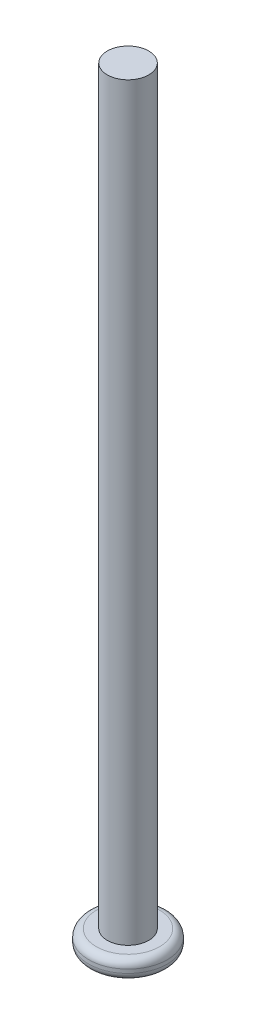
ISO-10303-21;
HEADER;
FILE_DESCRIPTION(('STEP AP214'),'2;1');
FILE_NAME('part.step','',(''),(''),'','','');
FILE_SCHEMA(('AUTOMOTIVE_DESIGN { 1 0 10303 214 1 1 1 1 }'));
ENDSEC;
DATA;
#1=APPLICATION_CONTEXT('core data for automotive mechanical design processes');
#2=APPLICATION_PROTOCOL_DEFINITION('international standard','automotive_design',2000,#1);
#3=PRODUCT_CONTEXT('',#1,'mechanical');
#4=PRODUCT('Part','Part','',(#3));
#5=PRODUCT_RELATED_PRODUCT_CATEGORY('part','',(#4));
#6=PRODUCT_DEFINITION_FORMATION('','',#4);
#7=PRODUCT_DEFINITION_CONTEXT('part definition',#1,'design');
#8=PRODUCT_DEFINITION('design','',#6,#7);
#9=PRODUCT_DEFINITION_SHAPE('','',#8);
#10=(LENGTH_UNIT() NAMED_UNIT(*) SI_UNIT(.MILLI.,.METRE.));
#11=(NAMED_UNIT(*) PLANE_ANGLE_UNIT() SI_UNIT($,.RADIAN.));
#12=(NAMED_UNIT(*) SI_UNIT($,.STERADIAN.) SOLID_ANGLE_UNIT());
#13=UNCERTAINTY_MEASURE_WITH_UNIT(LENGTH_MEASURE(1.E-05),#10,'distance_accuracy_value','');
#14=(GEOMETRIC_REPRESENTATION_CONTEXT(3) GLOBAL_UNCERTAINTY_ASSIGNED_CONTEXT((#13)) GLOBAL_UNIT_ASSIGNED_CONTEXT((#10,
#11,#12)) REPRESENTATION_CONTEXT('',''));
#15=CARTESIAN_POINT('',(0.,0.,0.));
#16=DIRECTION('',(0.,0.,1.));
#17=DIRECTION('',(1.,0.,0.));
#18=AXIS2_PLACEMENT_3D('',#15,#16,#17);
#19=CARTESIAN_POINT('',(-2.75,102.,0.));
#20=DIRECTION('',(0.,-1.,0.));
#21=DIRECTION('',(1.,0.,0.));
#22=AXIS2_PLACEMENT_3D('',#19,#20,#21);
#23=PLANE('',#22);
#24=CARTESIAN_POINT('',(0.,102.,0.));
#25=DIRECTION('',(0.,-1.,0.));
#26=DIRECTION('',(1.,0.,0.));
#27=AXIS2_PLACEMENT_3D('',#24,#25,#26);
#28=CIRCLE('',#27,2.75);
#29=CARTESIAN_POINT('',(2.74999999999999,102.,0.));
#30=VERTEX_POINT('',#29);
#31=EDGE_CURVE('E50',#30,#30,#28,.T.);
#32=ORIENTED_EDGE('',*,*,#31,.F.);
#33=EDGE_LOOP('',(#32));
#34=FACE_BOUND('',#33,.T.);
#35=ADVANCED_FACE('F30',(#34),#23,.F.);
#36=CARTESIAN_POINT('',(0.,0.,0.));
#37=DIRECTION('',(0.,-1.,0.));
#38=DIRECTION('',(1.,0.,0.));
#39=AXIS2_PLACEMENT_3D('',#36,#37,#38);
#40=CYLINDRICAL_SURFACE('',#39,2.74999999999999);
#41=CARTESIAN_POINT('',(0.,2.5,0.));
#42=DIRECTION('',(0.,-1.,0.));
#43=DIRECTION('',(1.,0.,0.));
#44=AXIS2_PLACEMENT_3D('',#41,#42,#43);
#45=CIRCLE('',#44,2.74999999999999);
#46=CARTESIAN_POINT('',(2.74999999999999,2.5,0.));
#47=VERTEX_POINT('',#46);
#48=EDGE_CURVE('E53',#47,#47,#45,.T.);
#49=ORIENTED_EDGE('',*,*,#48,.F.);
#50=EDGE_LOOP('',(#49));
#51=FACE_BOUND('',#50,.T.);
#52=ORIENTED_EDGE('',*,*,#31,.T.);
#53=EDGE_LOOP('',(#52));
#54=FACE_BOUND('',#53,.T.);
#55=ADVANCED_FACE('F59',(#51,#54),#40,.T.);
#56=CARTESIAN_POINT('',(-2.74999999999999,2.5,0.));
#57=DIRECTION('',(0.,-1.,0.));
#58=DIRECTION('',(1.,0.,0.));
#59=AXIS2_PLACEMENT_3D('',#56,#57,#58);
#60=PLANE('',#59);
#61=CARTESIAN_POINT('',(0.,2.5,0.));
#62=DIRECTION('',(0.,-1.,0.));
#63=DIRECTION('',(1.,0.,0.));
#64=AXIS2_PLACEMENT_3D('',#61,#62,#63);
#65=CIRCLE('',#64,4.2);
#66=CARTESIAN_POINT('',(4.2,2.5,0.));
#67=VERTEX_POINT('',#66);
#68=EDGE_CURVE('E37',#67,#67,#65,.F.);
#69=ORIENTED_EDGE('',*,*,#68,.T.);
#70=EDGE_LOOP('',(#69));
#71=FACE_BOUND('',#70,.T.);
#72=ORIENTED_EDGE('',*,*,#48,.T.);
#73=EDGE_LOOP('',(#72));
#74=FACE_BOUND('',#73,.T.);
#75=ADVANCED_FACE('F57',(#71,#74),#60,.F.);
#76=CARTESIAN_POINT('',(0.,0.,0.));
#77=DIRECTION('',(0.,-1.,0.));
#78=DIRECTION('',(1.,0.,0.));
#79=AXIS2_PLACEMENT_3D('',#76,#77,#78);
#80=CYLINDRICAL_SURFACE('',#79,5.2);
#81=CARTESIAN_POINT('',(0.,1.5,0.));
#82=DIRECTION('',(0.,-1.,0.));
#83=DIRECTION('',(1.,0.,0.));
#84=AXIS2_PLACEMENT_3D('',#81,#82,#83);
#85=CIRCLE('',#84,5.2);
#86=CARTESIAN_POINT('',(5.2,1.5,0.));
#87=VERTEX_POINT('',#86);
#88=EDGE_CURVE('E41',#87,#87,#85,.T.);
#89=ORIENTED_EDGE('',*,*,#88,.T.);
#90=EDGE_LOOP('',(#89));
#91=FACE_BOUND('',#90,.T.);
#92=CARTESIAN_POINT('',(0.,1.,0.));
#93=DIRECTION('',(0.,1.,0.));
#94=DIRECTION('',(-1.,0.,0.));
#95=AXIS2_PLACEMENT_3D('',#92,#93,#94);
#96=CIRCLE('',#95,5.2);
#97=CARTESIAN_POINT('',(-5.2,1.,0.));
#98=VERTEX_POINT('',#97);
#99=EDGE_CURVE('E45',#98,#98,#96,.T.);
#100=ORIENTED_EDGE('',*,*,#99,.T.);
#101=EDGE_LOOP('',(#100));
#102=FACE_BOUND('',#101,.T.);
#103=ADVANCED_FACE('F79',(#91,#102),#80,.T.);
#104=CARTESIAN_POINT('',(-5.2,0.,0.));
#105=DIRECTION('',(0.,1.,0.));
#106=DIRECTION('',(-1.,0.,0.));
#107=AXIS2_PLACEMENT_3D('',#104,#105,#106);
#108=PLANE('',#107);
#109=CARTESIAN_POINT('',(0.,0.,0.));
#110=DIRECTION('',(0.,1.,0.));
#111=DIRECTION('',(-1.,0.,0.));
#112=AXIS2_PLACEMENT_3D('',#109,#110,#111);
#113=CIRCLE('',#112,4.2);
#114=CARTESIAN_POINT('',(-4.2,0.,0.));
#115=VERTEX_POINT('',#114);
#116=EDGE_CURVE('E10',#115,#115,#113,.F.);
#117=ORIENTED_EDGE('',*,*,#116,.T.);
#118=EDGE_LOOP('',(#117));
#119=FACE_BOUND('',#118,.T.);
#120=ADVANCED_FACE('F72',(#119),#108,.F.);
#121=CARTESIAN_POINT('',(0.,1.5,0.));
#122=DIRECTION('',(0.,-1.,0.));
#123=DIRECTION('',(1.,0.,0.));
#124=AXIS2_PLACEMENT_3D('',#121,#122,#123);
#125=TOROIDAL_SURFACE('',#124,4.2,1.);
#126=ORIENTED_EDGE('',*,*,#68,.F.);
#127=EDGE_LOOP('',(#126));
#128=FACE_BOUND('',#127,.T.);
#129=ORIENTED_EDGE('',*,*,#88,.F.);
#130=EDGE_LOOP('',(#129));
#131=FACE_BOUND('',#130,.T.);
#132=ADVANCED_FACE('F70',(#128,#131),#125,.T.);
#133=CARTESIAN_POINT('',(0.,1.,0.));
#134=DIRECTION('',(0.,1.,0.));
#135=DIRECTION('',(-1.,0.,0.));
#136=AXIS2_PLACEMENT_3D('',#133,#134,#135);
#137=TOROIDAL_SURFACE('',#136,4.2,1.);
#138=ORIENTED_EDGE('',*,*,#99,.F.);
#139=EDGE_LOOP('',(#138));
#140=FACE_BOUND('',#139,.T.);
#141=ORIENTED_EDGE('',*,*,#116,.F.);
#142=EDGE_LOOP('',(#141));
#143=FACE_BOUND('',#142,.T.);
#144=ADVANCED_FACE('F32',(#140,#143),#137,.T.);
#145=CLOSED_SHELL('',(#35,#55,#75,#103,#120,#132,#144));
#146=MANIFOLD_SOLID_BREP('B2',#145);
#147=ADVANCED_BREP_SHAPE_REPRESENTATION('',(#18,#146),#14);
#148=SHAPE_DEFINITION_REPRESENTATION(#9,#147);
ENDSEC;
END-ISO-10303-21;
